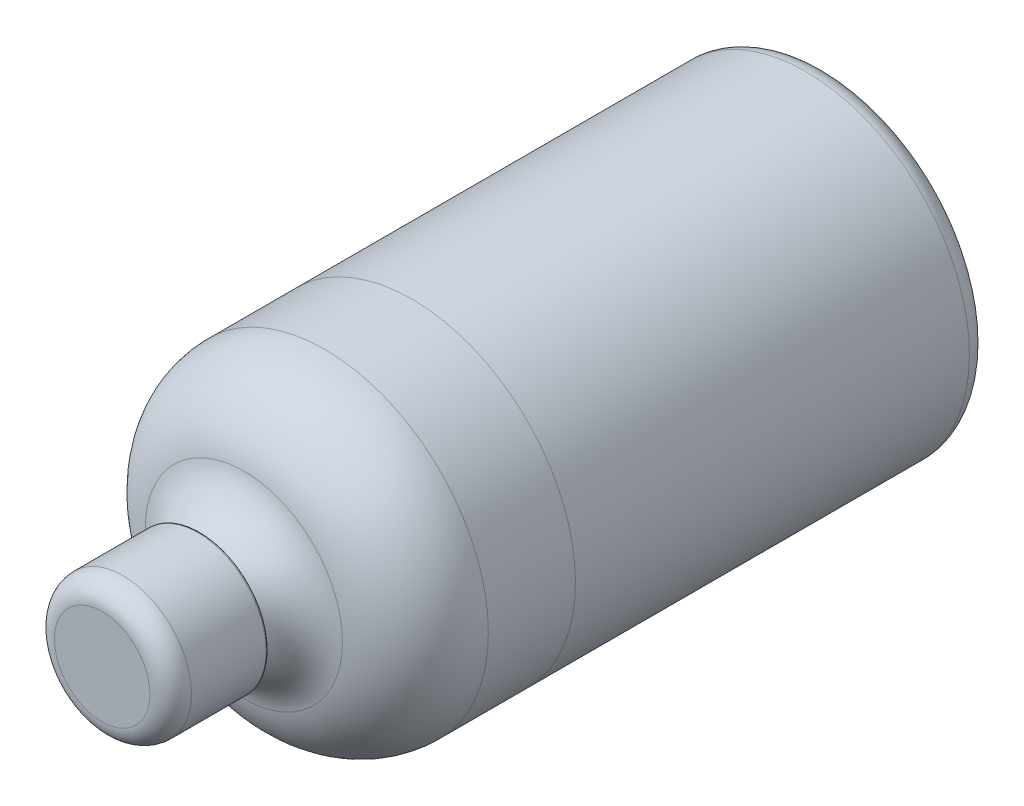
ISO-10303-21;
HEADER;
FILE_DESCRIPTION(('STEP AP214'),'2;1');
FILE_NAME('part.step','',(''),(''),'','','');
FILE_SCHEMA(('AUTOMOTIVE_DESIGN { 1 0 10303 214 1 1 1 1 }'));
ENDSEC;
DATA;
#1=APPLICATION_CONTEXT('core data for automotive mechanical design processes');
#2=APPLICATION_PROTOCOL_DEFINITION('international standard','automotive_design',2000,#1);
#3=PRODUCT_CONTEXT('',#1,'mechanical');
#4=PRODUCT('Part','Part','',(#3));
#5=PRODUCT_RELATED_PRODUCT_CATEGORY('part','',(#4));
#6=PRODUCT_DEFINITION_FORMATION('','',#4);
#7=PRODUCT_DEFINITION_CONTEXT('part definition',#1,'design');
#8=PRODUCT_DEFINITION('design','',#6,#7);
#9=PRODUCT_DEFINITION_SHAPE('','',#8);
#10=(LENGTH_UNIT() NAMED_UNIT(*) SI_UNIT(.MILLI.,.METRE.));
#11=(NAMED_UNIT(*) PLANE_ANGLE_UNIT() SI_UNIT($,.RADIAN.));
#12=(NAMED_UNIT(*) SI_UNIT($,.STERADIAN.) SOLID_ANGLE_UNIT());
#13=UNCERTAINTY_MEASURE_WITH_UNIT(LENGTH_MEASURE(1.E-05),#10,'distance_accuracy_value','');
#14=(GEOMETRIC_REPRESENTATION_CONTEXT(3) GLOBAL_UNCERTAINTY_ASSIGNED_CONTEXT((#13)) GLOBAL_UNIT_ASSIGNED_CONTEXT((#10,
#11,#12)) REPRESENTATION_CONTEXT('',''));
#15=CARTESIAN_POINT('',(0.,0.,0.));
#16=DIRECTION('',(0.,0.,1.));
#17=DIRECTION('',(1.,0.,0.));
#18=AXIS2_PLACEMENT_3D('',#15,#16,#17);
#19=CARTESIAN_POINT('',(0.,0.,35.814));
#20=DIRECTION('',(0.,0.,-1.));
#21=DIRECTION('',(-1.,0.,0.));
#22=AXIS2_PLACEMENT_3D('',#19,#20,#21);
#23=CYLINDRICAL_SURFACE('',#22,10.0145285510977);
#24=CARTESIAN_POINT('',(0.,0.,30.734));
#25=DIRECTION('',(0.,0.,1.));
#26=DIRECTION('',(1.,0.,0.));
#27=AXIS2_PLACEMENT_3D('',#24,#25,#26);
#28=CIRCLE('',#27,10.0145285510977);
#29=CARTESIAN_POINT('',(10.0145285510977,0.,30.734));
#30=VERTEX_POINT('',#29);
#31=EDGE_CURVE('P0_E31',#30,#30,#28,.F.);
#32=ORIENTED_EDGE('',*,*,#31,.T.);
#33=EDGE_LOOP('',(#32));
#34=FACE_BOUND('',#33,.T.);
#35=CARTESIAN_POINT('',(0.,0.,25.4));
#36=DIRECTION('',(0.,0.,1.));
#37=DIRECTION('',(1.,0.,0.));
#38=AXIS2_PLACEMENT_3D('',#35,#36,#37);
#39=CIRCLE('',#38,10.0145285510977);
#40=CARTESIAN_POINT('',(10.0145285510977,0.,25.4));
#41=VERTEX_POINT('',#40);
#42=EDGE_CURVE('P0_E38',#41,#41,#39,.T.);
#43=ORIENTED_EDGE('',*,*,#42,.T.);
#44=EDGE_LOOP('',(#43));
#45=FACE_BOUND('',#44,.T.);
#46=ADVANCED_FACE('P0_F15',(#34,#45),#23,.T.);
#47=CARTESIAN_POINT('',(0.,0.,25.4));
#48=DIRECTION('',(0.,0.,1.));
#49=DIRECTION('',(1.,0.,0.));
#50=AXIS2_PLACEMENT_3D('',#47,#48,#49);
#51=PLANE('',#50);
#52=ORIENTED_EDGE('',*,*,#42,.F.);
#53=EDGE_LOOP('',(#52));
#54=FACE_BOUND('',#53,.T.);
#55=ADVANCED_FACE('P0_F56',(#54),#51,.F.);
#56=CARTESIAN_POINT('',(0.,0.,41.36949));
#57=DIRECTION('',(0.,0.,-1.));
#58=DIRECTION('',(-1.,0.,0.));
#59=AXIS2_PLACEMENT_3D('',#56,#57,#58);
#60=CYLINDRICAL_SURFACE('',#59,3.49505218401121);
#61=CARTESIAN_POINT('',(0.,0.,38.8648726838674));
#62=DIRECTION('',(0.,0.,1.));
#63=DIRECTION('',(1.,0.,0.));
#64=AXIS2_PLACEMENT_3D('',#61,#62,#63);
#65=CIRCLE('',#64,3.49505218401121);
#66=CARTESIAN_POINT('',(3.49505218401121,0.,38.8648726838674));
#67=VERTEX_POINT('',#66);
#68=EDGE_CURVE('P0_E23',#67,#67,#65,.T.);
#69=ORIENTED_EDGE('',*,*,#68,.T.);
#70=EDGE_LOOP('',(#69));
#71=FACE_BOUND('',#70,.T.);
#72=CARTESIAN_POINT('',(0.,0.,41.36949));
#73=DIRECTION('',(0.,0.,1.));
#74=DIRECTION('',(1.,0.,0.));
#75=AXIS2_PLACEMENT_3D('',#72,#73,#74);
#76=CIRCLE('',#75,3.49505218401121);
#77=CARTESIAN_POINT('',(3.49505218401121,0.,41.36949));
#78=VERTEX_POINT('',#77);
#79=EDGE_CURVE('P0_E44',#78,#78,#76,.T.);
#80=ORIENTED_EDGE('',*,*,#79,.F.);
#81=EDGE_LOOP('',(#80));
#82=FACE_BOUND('',#81,.T.);
#83=ADVANCED_FACE('P0_F54',(#71,#82),#60,.T.);
#84=CARTESIAN_POINT('',(0.,0.,41.36949));
#85=DIRECTION('',(0.,0.,1.));
#86=DIRECTION('',(1.,0.,0.));
#87=AXIS2_PLACEMENT_3D('',#84,#85,#86);
#88=PLANE('',#87);
#89=ORIENTED_EDGE('',*,*,#79,.T.);
#90=EDGE_LOOP('',(#89));
#91=FACE_BOUND('',#90,.T.);
#92=ADVANCED_FACE('P0_F52',(#91),#88,.T.);
#93=CARTESIAN_POINT('',(0.,0.,30.734));
#94=DIRECTION('',(0.,0.,1.));
#95=DIRECTION('',(1.,0.,0.));
#96=AXIS2_PLACEMENT_3D('',#93,#94,#95);
#97=DEGENERATE_TOROIDAL_SURFACE('',#96,4.93452855109766,5.08,.T.);
#98=CARTESIAN_POINT('',(0.,0.,35.6925549025547));
#99=DIRECTION('',(0.,0.,-1.));
#100=DIRECTION('',(-1.,0.,0.));
#101=AXIS2_PLACEMENT_3D('',#98,#99,#100);
#102=CIRCLE('',#101,6.03867223665217);
#103=CARTESIAN_POINT('',(-6.03867223665217,0.,35.6925549025547));
#104=VERTEX_POINT('',#103);
#105=EDGE_CURVE('P0_E10',#104,#104,#102,.T.);
#106=ORIENTED_EDGE('',*,*,#105,.T.);
#107=EDGE_LOOP('',(#106));
#108=FACE_BOUND('',#107,.T.);
#109=ORIENTED_EDGE('',*,*,#31,.F.);
#110=EDGE_LOOP('',(#109));
#111=FACE_BOUND('',#110,.T.);
#112=ADVANCED_FACE('P0_F63',(#108,#111),#97,.T.);
#113=CARTESIAN_POINT('',(0.,0.,38.8648726838674));
#114=DIRECTION('',(0.,0.,1.));
#115=DIRECTION('',(1.,0.,0.));
#116=AXIS2_PLACEMENT_3D('',#113,#114,#115);
#117=TOROIDAL_SURFACE('',#116,6.74506648167787,3.25001429766666);
#118=ORIENTED_EDGE('',*,*,#105,.F.);
#119=EDGE_LOOP('',(#118));
#120=FACE_BOUND('',#119,.T.);
#121=ORIENTED_EDGE('',*,*,#68,.F.);
#122=EDGE_LOOP('',(#121));
#123=FACE_BOUND('',#122,.T.);
#124=ADVANCED_FACE('P0_F17',(#120,#123),#117,.F.);
#125=CLOSED_SHELL('',(#46,#55,#83,#92,#112,#124));
#126=MANIFOLD_SOLID_BREP('P0_B1',#125);
#127=CARTESIAN_POINT('',(0.,0.,25.4));
#128=DIRECTION('',(0.,0.,-1.));
#129=DIRECTION('',(-1.,0.,0.));
#130=AXIS2_PLACEMENT_3D('',#127,#128,#129);
#131=CYLINDRICAL_SURFACE('',#130,10.0145285510977);
#132=CARTESIAN_POINT('',(0.,0.,1.27));
#133=DIRECTION('',(0.,0.,1.));
#134=DIRECTION('',(1.,0.,0.));
#135=AXIS2_PLACEMENT_3D('',#132,#133,#134);
#136=CIRCLE('',#135,10.0145285510977);
#137=CARTESIAN_POINT('',(10.0145285510977,0.,1.27));
#138=VERTEX_POINT('',#137);
#139=EDGE_CURVE('P1_E23',#138,#138,#136,.T.);
#140=ORIENTED_EDGE('',*,*,#139,.T.);
#141=EDGE_LOOP('',(#140));
#142=FACE_BOUND('',#141,.T.);
#143=CARTESIAN_POINT('',(0.,0.,25.4));
#144=DIRECTION('',(0.,0.,1.));
#145=DIRECTION('',(1.,0.,0.));
#146=AXIS2_PLACEMENT_3D('',#143,#144,#145);
#147=CIRCLE('',#146,10.0145285510977);
#148=CARTESIAN_POINT('',(10.0145285510977,0.,25.4));
#149=VERTEX_POINT('',#148);
#150=EDGE_CURVE('P1_E31',#149,#149,#147,.T.);
#151=ORIENTED_EDGE('',*,*,#150,.F.);
#152=EDGE_LOOP('',(#151));
#153=FACE_BOUND('',#152,.T.);
#154=ADVANCED_FACE('P1_F15',(#142,#153),#131,.T.);
#155=CARTESIAN_POINT('',(0.,0.,25.4));
#156=DIRECTION('',(0.,0.,1.));
#157=DIRECTION('',(1.,0.,0.));
#158=AXIS2_PLACEMENT_3D('',#155,#156,#157);
#159=PLANE('',#158);
#160=ORIENTED_EDGE('',*,*,#150,.T.);
#161=EDGE_LOOP('',(#160));
#162=FACE_BOUND('',#161,.T.);
#163=ADVANCED_FACE('P1_F43',(#162),#159,.T.);
#164=CARTESIAN_POINT('',(0.,0.,0.));
#165=DIRECTION('',(0.,0.,1.));
#166=DIRECTION('',(1.,0.,0.));
#167=AXIS2_PLACEMENT_3D('',#164,#165,#166);
#168=PLANE('',#167);
#169=CARTESIAN_POINT('',(0.,0.,0.));
#170=DIRECTION('',(0.,0.,1.));
#171=DIRECTION('',(1.,0.,0.));
#172=AXIS2_PLACEMENT_3D('',#169,#170,#171);
#173=CIRCLE('',#172,8.74452855109766);
#174=CARTESIAN_POINT('',(8.74452855109766,0.,0.));
#175=VERTEX_POINT('',#174);
#176=EDGE_CURVE('P1_E10',#175,#175,#173,.F.);
#177=ORIENTED_EDGE('',*,*,#176,.T.);
#178=EDGE_LOOP('',(#177));
#179=FACE_BOUND('',#178,.T.);
#180=ADVANCED_FACE('P1_F50',(#179),#168,.F.);
#181=CARTESIAN_POINT('',(0.,0.,1.27));
#182=DIRECTION('',(0.,0.,1.));
#183=DIRECTION('',(1.,0.,0.));
#184=AXIS2_PLACEMENT_3D('',#181,#182,#183);
#185=TOROIDAL_SURFACE('',#184,8.74452855109766,1.27);
#186=ORIENTED_EDGE('',*,*,#176,.F.);
#187=EDGE_LOOP('',(#186));
#188=FACE_BOUND('',#187,.T.);
#189=ORIENTED_EDGE('',*,*,#139,.F.);
#190=EDGE_LOOP('',(#189));
#191=FACE_BOUND('',#190,.T.);
#192=ADVANCED_FACE('P1_F17',(#188,#191),#185,.T.);
#193=CLOSED_SHELL('',(#154,#163,#180,#192));
#194=MANIFOLD_SOLID_BREP('P1_B1',#193);
#195=CARTESIAN_POINT('',(0.,0.,44.36669));
#196=DIRECTION('',(0.,0.,-1.));
#197=DIRECTION('',(-1.,0.,0.));
#198=AXIS2_PLACEMENT_3D('',#195,#196,#197);
#199=CYLINDRICAL_SURFACE('',#198,4.19466500714033);
#200=CARTESIAN_POINT('',(0.,0.,38.52469));
#201=DIRECTION('',(0.,0.,1.));
#202=DIRECTION('',(1.,0.,0.));
#203=AXIS2_PLACEMENT_3D('',#200,#201,#202);
#204=CIRCLE('',#203,4.19466500714033);
#205=CARTESIAN_POINT('',(4.19466500714033,0.,38.52469));
#206=VERTEX_POINT('',#205);
#207=EDGE_CURVE('P2_E22',#206,#206,#204,.T.);
#208=ORIENTED_EDGE('',*,*,#207,.T.);
#209=EDGE_LOOP('',(#208));
#210=FACE_BOUND('',#209,.T.);
#211=CARTESIAN_POINT('',(0.,0.,43.09669));
#212=DIRECTION('',(0.,0.,1.));
#213=DIRECTION('',(1.,0.,0.));
#214=AXIS2_PLACEMENT_3D('',#211,#212,#213);
#215=CIRCLE('',#214,4.19466500714033);
#216=CARTESIAN_POINT('',(4.19466500714033,0.,43.09669));
#217=VERTEX_POINT('',#216);
#218=EDGE_CURVE('P2_E30',#217,#217,#215,.F.);
#219=ORIENTED_EDGE('',*,*,#218,.T.);
#220=EDGE_LOOP('',(#219));
#221=FACE_BOUND('',#220,.T.);
#222=ADVANCED_FACE('P2_F14',(#210,#221),#199,.T.);
#223=CARTESIAN_POINT('',(0.,0.,44.36669));
#224=DIRECTION('',(0.,0.,1.));
#225=DIRECTION('',(1.,0.,0.));
#226=AXIS2_PLACEMENT_3D('',#223,#224,#225);
#227=PLANE('',#226);
#228=CARTESIAN_POINT('',(0.,0.,44.36669));
#229=DIRECTION('',(0.,0.,1.));
#230=DIRECTION('',(1.,0.,0.));
#231=AXIS2_PLACEMENT_3D('',#228,#229,#230);
#232=CIRCLE('',#231,2.92466500714033);
#233=CARTESIAN_POINT('',(2.92466500714033,0.,44.36669));
#234=VERTEX_POINT('',#233);
#235=EDGE_CURVE('P2_E37',#234,#234,#232,.T.);
#236=ORIENTED_EDGE('',*,*,#235,.T.);
#237=EDGE_LOOP('',(#236));
#238=FACE_BOUND('',#237,.T.);
#239=ADVANCED_FACE('P2_F46',(#238),#227,.T.);
#240=CARTESIAN_POINT('',(0.,0.,38.37229));
#241=DIRECTION('',(0.,0.,1.));
#242=DIRECTION('',(1.,0.,0.));
#243=AXIS2_PLACEMENT_3D('',#240,#241,#242);
#244=PLANE('',#243);
#245=CARTESIAN_POINT('',(0.,0.,38.37229));
#246=DIRECTION('',(0.,0.,1.));
#247=DIRECTION('',(1.,0.,0.));
#248=AXIS2_PLACEMENT_3D('',#245,#246,#247);
#249=CIRCLE('',#248,4.04226500714033);
#250=CARTESIAN_POINT('',(4.04226500714033,0.,38.37229));
#251=VERTEX_POINT('',#250);
#252=EDGE_CURVE('P2_E9',#251,#251,#249,.F.);
#253=ORIENTED_EDGE('',*,*,#252,.T.);
#254=EDGE_LOOP('',(#253));
#255=FACE_BOUND('',#254,.T.);
#256=ADVANCED_FACE('P2_F50',(#255),#244,.F.);
#257=CARTESIAN_POINT('',(0.,0.,43.09669));
#258=DIRECTION('',(0.,0.,1.));
#259=DIRECTION('',(1.,0.,0.));
#260=AXIS2_PLACEMENT_3D('',#257,#258,#259);
#261=TOROIDAL_SURFACE('',#260,2.92466500714033,1.27);
#262=ORIENTED_EDGE('',*,*,#218,.F.);
#263=EDGE_LOOP('',(#262));
#264=FACE_BOUND('',#263,.T.);
#265=ORIENTED_EDGE('',*,*,#235,.F.);
#266=EDGE_LOOP('',(#265));
#267=FACE_BOUND('',#266,.T.);
#268=ADVANCED_FACE('P2_F48',(#264,#267),#261,.T.);
#269=CARTESIAN_POINT('',(0.,0.,38.52469));
#270=DIRECTION('',(0.,0.,1.));
#271=DIRECTION('',(1.,0.,0.));
#272=AXIS2_PLACEMENT_3D('',#269,#270,#271);
#273=TOROIDAL_SURFACE('',#272,4.04226500714033,0.1524);
#274=ORIENTED_EDGE('',*,*,#252,.F.);
#275=EDGE_LOOP('',(#274));
#276=FACE_BOUND('',#275,.T.);
#277=ORIENTED_EDGE('',*,*,#207,.F.);
#278=EDGE_LOOP('',(#277));
#279=FACE_BOUND('',#278,.T.);
#280=ADVANCED_FACE('P2_F16',(#276,#279),#273,.T.);
#281=CLOSED_SHELL('',(#222,#239,#256,#268,#280));
#282=MANIFOLD_SOLID_BREP('P2_B1',#281);
#283=ADVANCED_BREP_SHAPE_REPRESENTATION('',(#18,#126,#194,#282),#14);
#284=SHAPE_DEFINITION_REPRESENTATION(#9,#283);
ENDSEC;
END-ISO-10303-21;
